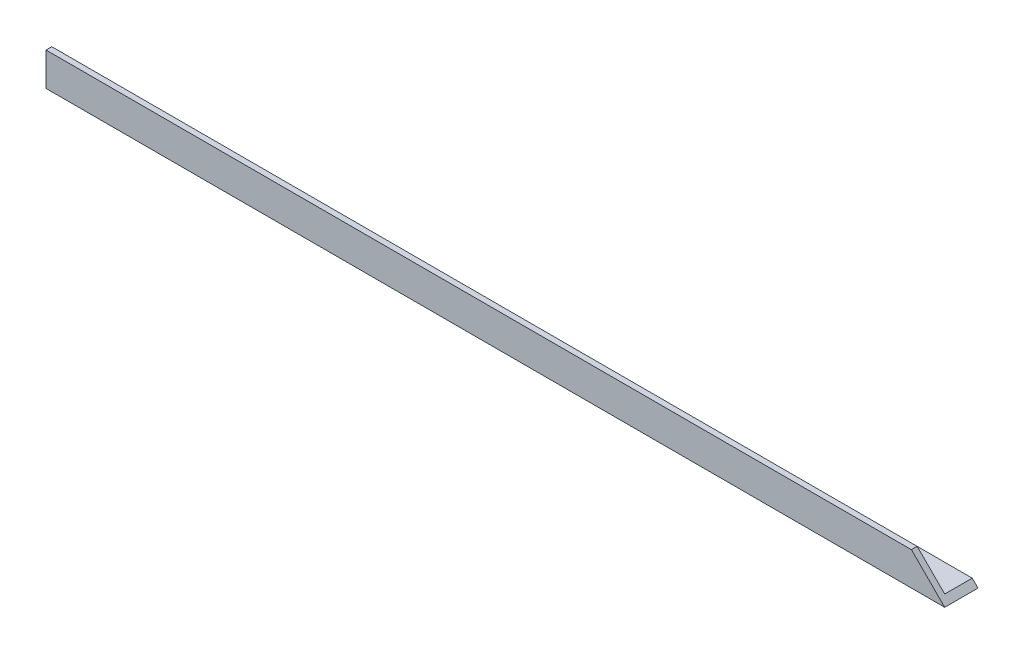
ISO-10303-21;
HEADER;
FILE_DESCRIPTION(('STEP AP214'),'2;1');
FILE_NAME('part.step','',(''),(''),'','','');
FILE_SCHEMA(('AUTOMOTIVE_DESIGN { 1 0 10303 214 1 1 1 1 }'));
ENDSEC;
DATA;
#1=APPLICATION_CONTEXT('core data for automotive mechanical design processes');
#2=APPLICATION_PROTOCOL_DEFINITION('international standard','automotive_design',2000,#1);
#3=PRODUCT_CONTEXT('',#1,'mechanical');
#4=PRODUCT('Part','Part','',(#3));
#5=PRODUCT_RELATED_PRODUCT_CATEGORY('part','',(#4));
#6=PRODUCT_DEFINITION_FORMATION('','',#4);
#7=PRODUCT_DEFINITION_CONTEXT('part definition',#1,'design');
#8=PRODUCT_DEFINITION('design','',#6,#7);
#9=PRODUCT_DEFINITION_SHAPE('','',#8);
#10=(LENGTH_UNIT() NAMED_UNIT(*) SI_UNIT(.MILLI.,.METRE.));
#11=(NAMED_UNIT(*) PLANE_ANGLE_UNIT() SI_UNIT($,.RADIAN.));
#12=(NAMED_UNIT(*) SI_UNIT($,.STERADIAN.) SOLID_ANGLE_UNIT());
#13=UNCERTAINTY_MEASURE_WITH_UNIT(LENGTH_MEASURE(1.E-05),#10,'distance_accuracy_value','');
#14=(GEOMETRIC_REPRESENTATION_CONTEXT(3) GLOBAL_UNCERTAINTY_ASSIGNED_CONTEXT((#13)) GLOBAL_UNIT_ASSIGNED_CONTEXT((#10,
#11,#12)) REPRESENTATION_CONTEXT('',''));
#15=CARTESIAN_POINT('',(0.,0.,0.));
#16=DIRECTION('',(0.,0.,1.));
#17=DIRECTION('',(1.,0.,0.));
#18=AXIS2_PLACEMENT_3D('',#15,#16,#17);
#19=CARTESIAN_POINT('',(540.,20.,0.));
#20=DIRECTION('',(0.,0.,-1.));
#21=DIRECTION('',(0.,1.,0.));
#22=AXIS2_PLACEMENT_3D('',#19,#20,#21);
#23=PLANE('',#22);
#24=DIRECTION('',(-0.707106781186548,0.707106781186547,0.));
#25=VECTOR('',#24,1.);
#26=CARTESIAN_POINT('',(540.,0.,0.));
#27=LINE('',#26,#25);
#28=CARTESIAN_POINT('',(540.,0.,0.));
#29=VERTEX_POINT('',#28);
#30=CARTESIAN_POINT('',(520.,20.,0.));
#31=VERTEX_POINT('',#30);
#32=EDGE_CURVE('E52',#29,#31,#27,.T.);
#33=ORIENTED_EDGE('',*,*,#32,.T.);
#34=DIRECTION('',(-1.,0.,0.));
#35=VECTOR('',#34,1.);
#36=CARTESIAN_POINT('',(540.,20.,0.));
#37=LINE('',#36,#35);
#38=CARTESIAN_POINT('',(0.,20.,0.));
#39=VERTEX_POINT('',#38);
#40=EDGE_CURVE('E88',#31,#39,#37,.T.);
#41=ORIENTED_EDGE('',*,*,#40,.T.);
#42=DIRECTION('',(0.,-1.,0.));
#43=VECTOR('',#42,1.);
#44=CARTESIAN_POINT('',(0.,20.,0.));
#45=LINE('',#44,#43);
#46=CARTESIAN_POINT('',(0.,0.,0.));
#47=VERTEX_POINT('',#46);
#48=EDGE_CURVE('E101',#39,#47,#45,.T.);
#49=ORIENTED_EDGE('',*,*,#48,.T.);
#50=DIRECTION('',(-1.,0.,0.));
#51=VECTOR('',#50,1.);
#52=CARTESIAN_POINT('',(540.,0.,0.));
#53=LINE('',#52,#51);
#54=EDGE_CURVE('E11',#29,#47,#53,.T.);
#55=ORIENTED_EDGE('',*,*,#54,.F.);
#56=EDGE_LOOP('',(#33,#41,#49,#55));
#57=FACE_BOUND('',#56,.T.);
#58=ADVANCED_FACE('F37',(#57),#23,.F.);
#59=CARTESIAN_POINT('',(540.,0.,-20.));
#60=DIRECTION('',(0.,0.,1.));
#61=DIRECTION('',(1.,0.,0.));
#62=AXIS2_PLACEMENT_3D('',#59,#60,#61);
#63=PLANE('',#62);
#64=DIRECTION('',(-0.707106781186548,0.707106781186547,0.));
#65=VECTOR('',#64,1.);
#66=CARTESIAN_POINT('',(540.,0.,-20.));
#67=LINE('',#66,#65);
#68=CARTESIAN_POINT('',(540.,0.,-20.));
#69=VERTEX_POINT('',#68);
#70=CARTESIAN_POINT('',(536.538821532984,3.46117846701572,-20.));
#71=VERTEX_POINT('',#70);
#72=EDGE_CURVE('E121',#69,#71,#67,.T.);
#73=ORIENTED_EDGE('',*,*,#72,.F.);
#74=DIRECTION('',(-1.,0.,0.));
#75=VECTOR('',#74,1.);
#76=CARTESIAN_POINT('',(540.,0.,-20.));
#77=LINE('',#76,#75);
#78=CARTESIAN_POINT('',(0.,0.,-20.));
#79=VERTEX_POINT('',#78);
#80=EDGE_CURVE('E45',#69,#79,#77,.T.);
#81=ORIENTED_EDGE('',*,*,#80,.T.);
#82=DIRECTION('',(0.,1.,0.));
#83=VECTOR('',#82,1.);
#84=CARTESIAN_POINT('',(0.,0.,-20.));
#85=LINE('',#84,#83);
#86=CARTESIAN_POINT('',(0.,3.46117846701572,-20.));
#87=VERTEX_POINT('',#86);
#88=EDGE_CURVE('E118',#79,#87,#85,.T.);
#89=ORIENTED_EDGE('',*,*,#88,.T.);
#90=DIRECTION('',(-1.,0.,0.));
#91=VECTOR('',#90,1.);
#92=CARTESIAN_POINT('',(540.,3.46117846701572,-20.));
#93=LINE('',#92,#91);
#94=EDGE_CURVE('E109',#71,#87,#93,.T.);
#95=ORIENTED_EDGE('',*,*,#94,.F.);
#96=EDGE_LOOP('',(#73,#81,#89,#95));
#97=FACE_BOUND('',#96,.T.);
#98=ADVANCED_FACE('F116',(#97),#63,.F.);
#99=CARTESIAN_POINT('',(540.,3.46117846701572,-20.));
#100=DIRECTION('',(0.,-1.,0.));
#101=DIRECTION('',(0.,0.,-1.));
#102=AXIS2_PLACEMENT_3D('',#99,#100,#101);
#103=PLANE('',#102);
#104=DIRECTION('',(0.,0.,1.));
#105=VECTOR('',#104,1.);
#106=CARTESIAN_POINT('',(536.538821532984,3.46117846701572,-20.));
#107=LINE('',#106,#105);
#108=CARTESIAN_POINT('',(536.538821532984,3.46117846701572,-3.46117846701572));
#109=VERTEX_POINT('',#108);
#110=EDGE_CURVE('E127',#71,#109,#107,.T.);
#111=ORIENTED_EDGE('',*,*,#110,.F.);
#112=ORIENTED_EDGE('',*,*,#94,.T.);
#113=DIRECTION('',(0.,0.,1.));
#114=VECTOR('',#113,1.);
#115=CARTESIAN_POINT('',(0.,3.46117846701572,-20.));
#116=LINE('',#115,#114);
#117=CARTESIAN_POINT('',(0.,3.46117846701572,-3.46117846701572));
#118=VERTEX_POINT('',#117);
#119=EDGE_CURVE('E97',#87,#118,#116,.T.);
#120=ORIENTED_EDGE('',*,*,#119,.T.);
#121=DIRECTION('',(-1.,0.,0.));
#122=VECTOR('',#121,1.);
#123=CARTESIAN_POINT('',(540.,3.46117846701572,-3.46117846701572));
#124=LINE('',#123,#122);
#125=EDGE_CURVE('E87',#109,#118,#124,.T.);
#126=ORIENTED_EDGE('',*,*,#125,.F.);
#127=EDGE_LOOP('',(#111,#112,#120,#126));
#128=FACE_BOUND('',#127,.T.);
#129=ADVANCED_FACE('F141',(#128),#103,.F.);
#130=CARTESIAN_POINT('',(540.,3.46117846701572,-3.46117846701572));
#131=DIRECTION('',(0.,0.,1.));
#132=DIRECTION('',(1.,0.,0.));
#133=AXIS2_PLACEMENT_3D('',#130,#131,#132);
#134=PLANE('',#133);
#135=DIRECTION('',(-0.707106781186548,0.707106781186547,0.));
#136=VECTOR('',#135,1.);
#137=CARTESIAN_POINT('',(538.269410766492,1.73058923350786,-3.46117846701572));
#138=LINE('',#137,#136);
#139=CARTESIAN_POINT('',(520.,20.,-3.46117846701572));
#140=VERTEX_POINT('',#139);
#141=EDGE_CURVE('E131',#109,#140,#138,.T.);
#142=ORIENTED_EDGE('',*,*,#141,.F.);
#143=ORIENTED_EDGE('',*,*,#125,.T.);
#144=DIRECTION('',(0.,1.,0.));
#145=VECTOR('',#144,1.);
#146=CARTESIAN_POINT('',(0.,3.46117846701572,-3.46117846701572));
#147=LINE('',#146,#145);
#148=CARTESIAN_POINT('',(0.,20.,-3.46117846701572));
#149=VERTEX_POINT('',#148);
#150=EDGE_CURVE('E91',#118,#149,#147,.T.);
#151=ORIENTED_EDGE('',*,*,#150,.T.);
#152=DIRECTION('',(-1.,0.,0.));
#153=VECTOR('',#152,1.);
#154=CARTESIAN_POINT('',(540.,20.,-3.46117846701572));
#155=LINE('',#154,#153);
#156=EDGE_CURVE('E76',#140,#149,#155,.T.);
#157=ORIENTED_EDGE('',*,*,#156,.F.);
#158=EDGE_LOOP('',(#142,#143,#151,#157));
#159=FACE_BOUND('',#158,.T.);
#160=ADVANCED_FACE('F92',(#159),#134,.F.);
#161=CARTESIAN_POINT('',(540.,20.,-3.46117846701572));
#162=DIRECTION('',(0.,-1.,0.));
#163=DIRECTION('',(0.,0.,-1.));
#164=AXIS2_PLACEMENT_3D('',#161,#162,#163);
#165=PLANE('',#164);
#166=DIRECTION('',(0.,0.,1.));
#167=VECTOR('',#166,1.);
#168=CARTESIAN_POINT('',(520.,20.,-20.));
#169=LINE('',#168,#167);
#170=EDGE_CURVE('E84',#140,#31,#169,.T.);
#171=ORIENTED_EDGE('',*,*,#170,.F.);
#172=ORIENTED_EDGE('',*,*,#156,.T.);
#173=DIRECTION('',(0.,0.,1.));
#174=VECTOR('',#173,1.);
#175=CARTESIAN_POINT('',(0.,20.,-3.46117846701572));
#176=LINE('',#175,#174);
#177=EDGE_CURVE('E81',#149,#39,#176,.T.);
#178=ORIENTED_EDGE('',*,*,#177,.T.);
#179=ORIENTED_EDGE('',*,*,#40,.F.);
#180=EDGE_LOOP('',(#171,#172,#178,#179));
#181=FACE_BOUND('',#180,.T.);
#182=ADVANCED_FACE('F78',(#181),#165,.F.);
#183=CARTESIAN_POINT('',(540.,0.,0.));
#184=DIRECTION('',(0.,1.,0.));
#185=DIRECTION('',(0.,0.,1.));
#186=AXIS2_PLACEMENT_3D('',#183,#184,#185);
#187=PLANE('',#186);
#188=DIRECTION('',(0.,0.,-1.));
#189=VECTOR('',#188,1.);
#190=CARTESIAN_POINT('',(0.,0.,0.));
#191=LINE('',#190,#189);
#192=EDGE_CURVE('E123',#47,#79,#191,.T.);
#193=ORIENTED_EDGE('',*,*,#192,.T.);
#194=ORIENTED_EDGE('',*,*,#80,.F.);
#195=DIRECTION('',(0.,0.,-1.));
#196=VECTOR('',#195,1.);
#197=CARTESIAN_POINT('',(540.,0.,0.));
#198=LINE('',#197,#196);
#199=EDGE_CURVE('E102',#29,#69,#198,.T.);
#200=ORIENTED_EDGE('',*,*,#199,.F.);
#201=ORIENTED_EDGE('',*,*,#54,.T.);
#202=EDGE_LOOP('',(#193,#194,#200,#201));
#203=FACE_BOUND('',#202,.T.);
#204=ADVANCED_FACE('F147',(#203),#187,.F.);
#205=CARTESIAN_POINT('',(0.,0.,0.));
#206=DIRECTION('',(1.,0.,0.));
#207=DIRECTION('',(0.,0.,-1.));
#208=AXIS2_PLACEMENT_3D('',#205,#206,#207);
#209=PLANE('',#208);
#210=ORIENTED_EDGE('',*,*,#48,.F.);
#211=ORIENTED_EDGE('',*,*,#177,.F.);
#212=ORIENTED_EDGE('',*,*,#150,.F.);
#213=ORIENTED_EDGE('',*,*,#119,.F.);
#214=ORIENTED_EDGE('',*,*,#88,.F.);
#215=ORIENTED_EDGE('',*,*,#192,.F.);
#216=EDGE_LOOP('',(#210,#211,#212,#213,#214,#215));
#217=FACE_BOUND('',#216,.T.);
#218=ADVANCED_FACE('F99',(#217),#209,.F.);
#219=CARTESIAN_POINT('',(540.,0.,-20.));
#220=DIRECTION('',(0.707106781186547,0.707106781186548,0.));
#221=DIRECTION('',(-0.707106781186548,0.707106781186547,0.));
#222=AXIS2_PLACEMENT_3D('',#219,#220,#221);
#223=PLANE('',#222);
#224=ORIENTED_EDGE('',*,*,#110,.T.);
#225=ORIENTED_EDGE('',*,*,#141,.T.);
#226=ORIENTED_EDGE('',*,*,#170,.T.);
#227=ORIENTED_EDGE('',*,*,#32,.F.);
#228=ORIENTED_EDGE('',*,*,#199,.T.);
#229=ORIENTED_EDGE('',*,*,#72,.T.);
#230=EDGE_LOOP('',(#224,#225,#226,#227,#228,#229));
#231=FACE_BOUND('',#230,.T.);
#232=ADVANCED_FACE('F138',(#231),#223,.T.);
#233=CLOSED_SHELL('',(#58,#98,#129,#160,#182,#204,#218,#232));
#234=MANIFOLD_SOLID_BREP('B2',#233);
#235=ADVANCED_BREP_SHAPE_REPRESENTATION('',(#18,#234),#14);
#236=SHAPE_DEFINITION_REPRESENTATION(#9,#235);
ENDSEC;
END-ISO-10303-21;
